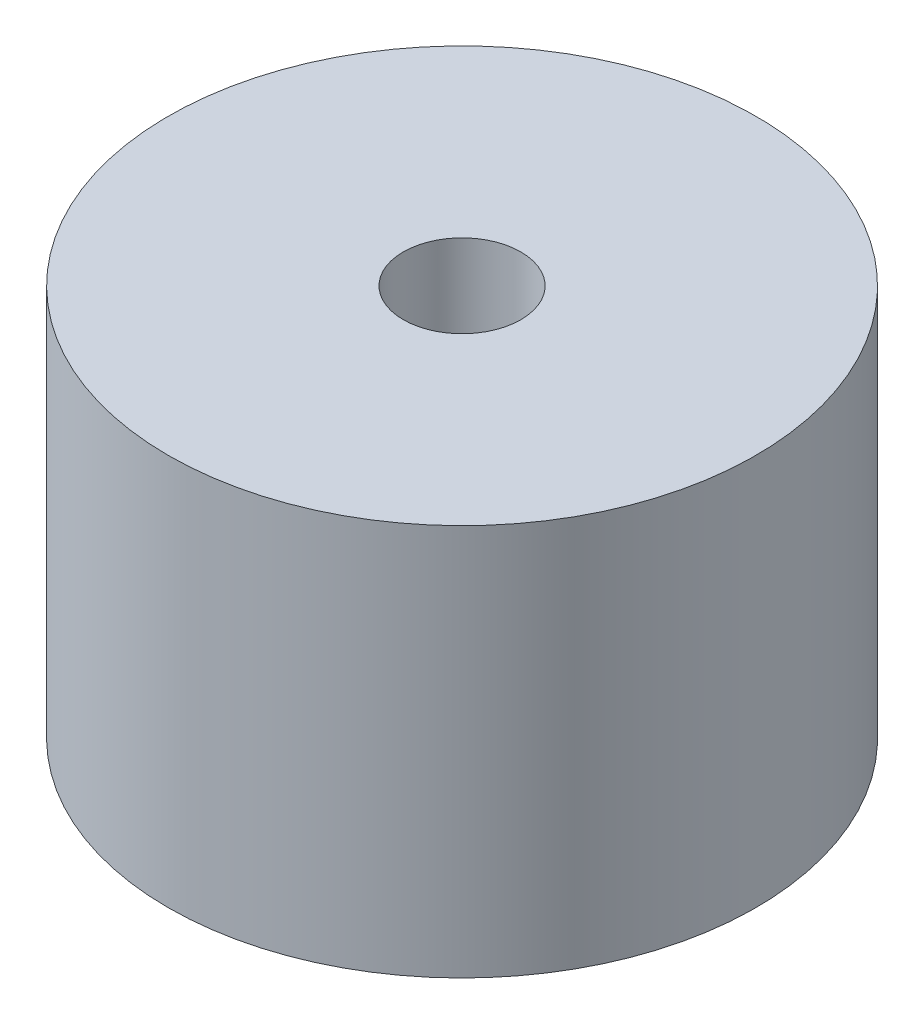
ISO-10303-21;
HEADER;
FILE_DESCRIPTION(('STEP AP214'),'2;1');
FILE_NAME('part.step','',(''),(''),'','','');
FILE_SCHEMA(('AUTOMOTIVE_DESIGN { 1 0 10303 214 1 1 1 1 }'));
ENDSEC;
DATA;
#1=APPLICATION_CONTEXT('core data for automotive mechanical design processes');
#2=APPLICATION_PROTOCOL_DEFINITION('international standard','automotive_design',2000,#1);
#3=PRODUCT_CONTEXT('',#1,'mechanical');
#4=PRODUCT('Part','Part','',(#3));
#5=PRODUCT_RELATED_PRODUCT_CATEGORY('part','',(#4));
#6=PRODUCT_DEFINITION_FORMATION('','',#4);
#7=PRODUCT_DEFINITION_CONTEXT('part definition',#1,'design');
#8=PRODUCT_DEFINITION('design','',#6,#7);
#9=PRODUCT_DEFINITION_SHAPE('','',#8);
#10=(LENGTH_UNIT() NAMED_UNIT(*) SI_UNIT(.MILLI.,.METRE.));
#11=(NAMED_UNIT(*) PLANE_ANGLE_UNIT() SI_UNIT($,.RADIAN.));
#12=(NAMED_UNIT(*) SI_UNIT($,.STERADIAN.) SOLID_ANGLE_UNIT());
#13=UNCERTAINTY_MEASURE_WITH_UNIT(LENGTH_MEASURE(1.E-05),#10,'distance_accuracy_value','');
#14=(GEOMETRIC_REPRESENTATION_CONTEXT(3) GLOBAL_UNCERTAINTY_ASSIGNED_CONTEXT((#13)) GLOBAL_UNIT_ASSIGNED_CONTEXT((#10,
#11,#12)) REPRESENTATION_CONTEXT('',''));
#15=CARTESIAN_POINT('',(0.,0.,0.));
#16=DIRECTION('',(0.,0.,1.));
#17=DIRECTION('',(1.,0.,0.));
#18=AXIS2_PLACEMENT_3D('',#15,#16,#17);
#19=CARTESIAN_POINT('',(0.,20.,0.));
#20=DIRECTION('',(0.,-1.,0.));
#21=DIRECTION('',(0.,0.,-1.));
#22=AXIS2_PLACEMENT_3D('',#19,#20,#21);
#23=CYLINDRICAL_SURFACE('',#22,15.);
#24=CARTESIAN_POINT('',(0.,20.,0.));
#25=DIRECTION('',(0.,1.,0.));
#26=DIRECTION('',(0.,0.,1.));
#27=AXIS2_PLACEMENT_3D('',#24,#25,#26);
#28=CIRCLE('',#27,15.);
#29=CARTESIAN_POINT('',(0.,20.,15.));
#30=VERTEX_POINT('',#29);
#31=EDGE_CURVE('E10',#30,#30,#28,.T.);
#32=ORIENTED_EDGE('',*,*,#31,.F.);
#33=EDGE_LOOP('',(#32));
#34=FACE_BOUND('',#33,.T.);
#35=CARTESIAN_POINT('',(0.,0.,0.));
#36=DIRECTION('',(0.,1.,0.));
#37=DIRECTION('',(0.,0.,1.));
#38=AXIS2_PLACEMENT_3D('',#35,#36,#37);
#39=CIRCLE('',#38,15.);
#40=CARTESIAN_POINT('',(0.,0.,15.));
#41=VERTEX_POINT('',#40);
#42=EDGE_CURVE('E33',#41,#41,#39,.T.);
#43=ORIENTED_EDGE('',*,*,#42,.T.);
#44=EDGE_LOOP('',(#43));
#45=FACE_BOUND('',#44,.T.);
#46=ADVANCED_FACE('F30',(#34,#45),#23,.T.);
#47=CARTESIAN_POINT('',(0.,20.,0.));
#48=DIRECTION('',(0.,1.,0.));
#49=DIRECTION('',(0.,0.,1.));
#50=AXIS2_PLACEMENT_3D('',#47,#48,#49);
#51=PLANE('',#50);
#52=CARTESIAN_POINT('',(0.,20.,0.));
#53=DIRECTION('',(0.,1.,0.));
#54=DIRECTION('',(0.,0.,1.));
#55=AXIS2_PLACEMENT_3D('',#52,#53,#54);
#56=CIRCLE('',#55,3.);
#57=CARTESIAN_POINT('',(0.,20.,3.));
#58=VERTEX_POINT('',#57);
#59=EDGE_CURVE('E45',#58,#58,#56,.T.);
#60=ORIENTED_EDGE('',*,*,#59,.F.);
#61=EDGE_LOOP('',(#60));
#62=FACE_BOUND('',#61,.T.);
#63=ORIENTED_EDGE('',*,*,#31,.T.);
#64=EDGE_LOOP('',(#63));
#65=FACE_BOUND('',#64,.T.);
#66=ADVANCED_FACE('F91',(#62,#65),#51,.T.);
#67=CARTESIAN_POINT('',(0.,0.,0.));
#68=DIRECTION('',(0.,1.,0.));
#69=DIRECTION('',(0.,0.,1.));
#70=AXIS2_PLACEMENT_3D('',#67,#68,#69);
#71=PLANE('',#70);
#72=CARTESIAN_POINT('',(0.,0.,-12.7));
#73=DIRECTION('',(0.,-1.,0.));
#74=DIRECTION('',(0.,0.,-1.));
#75=AXIS2_PLACEMENT_3D('',#72,#73,#74);
#76=CIRCLE('',#75,1.5);
#77=CARTESIAN_POINT('',(0.,0.,-14.2));
#78=VERTEX_POINT('',#77);
#79=EDGE_CURVE('E72',#78,#78,#76,.T.);
#80=ORIENTED_EDGE('',*,*,#79,.F.);
#81=EDGE_LOOP('',(#80));
#82=FACE_BOUND('',#81,.T.);
#83=CARTESIAN_POINT('',(-12.7,0.,0.));
#84=DIRECTION('',(0.,-1.,0.));
#85=DIRECTION('',(0.,0.,-1.));
#86=AXIS2_PLACEMENT_3D('',#83,#84,#85);
#87=CIRCLE('',#86,1.5);
#88=CARTESIAN_POINT('',(-12.7,0.,-1.5));
#89=VERTEX_POINT('',#88);
#90=EDGE_CURVE('E66',#89,#89,#87,.T.);
#91=ORIENTED_EDGE('',*,*,#90,.F.);
#92=EDGE_LOOP('',(#91));
#93=FACE_BOUND('',#92,.T.);
#94=CARTESIAN_POINT('',(0.,0.,12.7));
#95=DIRECTION('',(0.,-1.,0.));
#96=DIRECTION('',(0.,0.,-1.));
#97=AXIS2_PLACEMENT_3D('',#94,#95,#96);
#98=CIRCLE('',#97,1.5);
#99=CARTESIAN_POINT('',(0.,0.,11.2));
#100=VERTEX_POINT('',#99);
#101=EDGE_CURVE('E60',#100,#100,#98,.T.);
#102=ORIENTED_EDGE('',*,*,#101,.F.);
#103=EDGE_LOOP('',(#102));
#104=FACE_BOUND('',#103,.T.);
#105=CARTESIAN_POINT('',(12.7,0.,0.));
#106=DIRECTION('',(0.,-1.,0.));
#107=DIRECTION('',(0.,0.,-1.));
#108=AXIS2_PLACEMENT_3D('',#105,#106,#107);
#109=CIRCLE('',#108,1.5);
#110=CARTESIAN_POINT('',(12.7,0.,-1.5));
#111=VERTEX_POINT('',#110);
#112=EDGE_CURVE('E54',#111,#111,#109,.T.);
#113=ORIENTED_EDGE('',*,*,#112,.F.);
#114=EDGE_LOOP('',(#113));
#115=FACE_BOUND('',#114,.T.);
#116=CARTESIAN_POINT('',(0.,0.,0.));
#117=DIRECTION('',(0.,-1.,0.));
#118=DIRECTION('',(0.,0.,-1.));
#119=AXIS2_PLACEMENT_3D('',#116,#117,#118);
#120=CIRCLE('',#119,10.);
#121=CARTESIAN_POINT('',(0.,0.,-10.));
#122=VERTEX_POINT('',#121);
#123=EDGE_CURVE('E42',#122,#122,#120,.T.);
#124=ORIENTED_EDGE('',*,*,#123,.F.);
#125=EDGE_LOOP('',(#124));
#126=FACE_BOUND('',#125,.T.);
#127=ORIENTED_EDGE('',*,*,#42,.F.);
#128=EDGE_LOOP('',(#127));
#129=FACE_BOUND('',#128,.T.);
#130=ADVANCED_FACE('F87',(#82,#93,#104,#115,#126,#129),#71,.F.);
#131=CARTESIAN_POINT('',(0.,12.,0.));
#132=DIRECTION('',(0.,-1.,0.));
#133=DIRECTION('',(0.,0.,-1.));
#134=AXIS2_PLACEMENT_3D('',#131,#132,#133);
#135=CYLINDRICAL_SURFACE('',#134,10.);
#136=CARTESIAN_POINT('',(0.,12.,0.));
#137=DIRECTION('',(0.,-1.,0.));
#138=DIRECTION('',(0.,0.,-1.));
#139=AXIS2_PLACEMENT_3D('',#136,#137,#138);
#140=CIRCLE('',#139,10.);
#141=CARTESIAN_POINT('',(0.,12.,-10.));
#142=VERTEX_POINT('',#141);
#143=EDGE_CURVE('E40',#142,#142,#140,.T.);
#144=ORIENTED_EDGE('',*,*,#143,.F.);
#145=EDGE_LOOP('',(#144));
#146=FACE_BOUND('',#145,.T.);
#147=ORIENTED_EDGE('',*,*,#123,.T.);
#148=EDGE_LOOP('',(#147));
#149=FACE_BOUND('',#148,.T.);
#150=ADVANCED_FACE('F90',(#146,#149),#135,.F.);
#151=CARTESIAN_POINT('',(0.,12.,0.));
#152=DIRECTION('',(0.,-1.,0.));
#153=DIRECTION('',(0.,0.,-1.));
#154=AXIS2_PLACEMENT_3D('',#151,#152,#153);
#155=PLANE('',#154);
#156=CARTESIAN_POINT('',(0.,12.,0.));
#157=DIRECTION('',(0.,-1.,0.));
#158=DIRECTION('',(0.,0.,-1.));
#159=AXIS2_PLACEMENT_3D('',#156,#157,#158);
#160=CIRCLE('',#159,3.);
#161=CARTESIAN_POINT('',(0.,12.,-3.));
#162=VERTEX_POINT('',#161);
#163=EDGE_CURVE('E50',#162,#162,#160,.T.);
#164=ORIENTED_EDGE('',*,*,#163,.F.);
#165=EDGE_LOOP('',(#164));
#166=FACE_BOUND('',#165,.T.);
#167=ORIENTED_EDGE('',*,*,#143,.T.);
#168=EDGE_LOOP('',(#167));
#169=FACE_BOUND('',#168,.T.);
#170=ADVANCED_FACE('F115',(#166,#169),#155,.T.);
#171=CARTESIAN_POINT('',(0.,24.,0.));
#172=DIRECTION('',(0.,-1.,0.));
#173=DIRECTION('',(0.,0.,-1.));
#174=AXIS2_PLACEMENT_3D('',#171,#172,#173);
#175=CYLINDRICAL_SURFACE('',#174,3.);
#176=ORIENTED_EDGE('',*,*,#59,.T.);
#177=EDGE_LOOP('',(#176));
#178=FACE_BOUND('',#177,.T.);
#179=ORIENTED_EDGE('',*,*,#163,.T.);
#180=EDGE_LOOP('',(#179));
#181=FACE_BOUND('',#180,.T.);
#182=ADVANCED_FACE('F119',(#178,#181),#175,.F.);
#183=CARTESIAN_POINT('',(12.7,8.,0.));
#184=DIRECTION('',(0.,-1.,0.));
#185=DIRECTION('',(0.,0.,-1.));
#186=AXIS2_PLACEMENT_3D('',#183,#184,#185);
#187=CYLINDRICAL_SURFACE('',#186,1.5);
#188=CARTESIAN_POINT('',(12.7,8.,0.));
#189=DIRECTION('',(0.,-1.,0.));
#190=DIRECTION('',(0.,0.,-1.));
#191=AXIS2_PLACEMENT_3D('',#188,#189,#190);
#192=CIRCLE('',#191,1.5);
#193=CARTESIAN_POINT('',(12.7,8.,-1.5));
#194=VERTEX_POINT('',#193);
#195=EDGE_CURVE('E53',#194,#194,#192,.T.);
#196=ORIENTED_EDGE('',*,*,#195,.F.);
#197=EDGE_LOOP('',(#196));
#198=FACE_BOUND('',#197,.T.);
#199=ORIENTED_EDGE('',*,*,#112,.T.);
#200=EDGE_LOOP('',(#199));
#201=FACE_BOUND('',#200,.T.);
#202=ADVANCED_FACE('F123',(#198,#201),#187,.F.);
#203=CARTESIAN_POINT('',(12.7,8.,0.));
#204=DIRECTION('',(0.,-1.,0.));
#205=DIRECTION('',(0.,0.,-1.));
#206=AXIS2_PLACEMENT_3D('',#203,#204,#205);
#207=PLANE('',#206);
#208=ORIENTED_EDGE('',*,*,#195,.T.);
#209=EDGE_LOOP('',(#208));
#210=FACE_BOUND('',#209,.T.);
#211=ADVANCED_FACE('F127',(#210),#207,.T.);
#212=CARTESIAN_POINT('',(0.,8.,12.7));
#213=DIRECTION('',(0.,-1.,0.));
#214=DIRECTION('',(0.,0.,-1.));
#215=AXIS2_PLACEMENT_3D('',#212,#213,#214);
#216=CYLINDRICAL_SURFACE('',#215,1.5);
#217=CARTESIAN_POINT('',(0.,8.,12.7));
#218=DIRECTION('',(0.,-1.,0.));
#219=DIRECTION('',(0.,0.,-1.));
#220=AXIS2_PLACEMENT_3D('',#217,#218,#219);
#221=CIRCLE('',#220,1.5);
#222=CARTESIAN_POINT('',(0.,8.,11.2));
#223=VERTEX_POINT('',#222);
#224=EDGE_CURVE('E57',#223,#223,#221,.T.);
#225=ORIENTED_EDGE('',*,*,#224,.F.);
#226=EDGE_LOOP('',(#225));
#227=FACE_BOUND('',#226,.T.);
#228=ORIENTED_EDGE('',*,*,#101,.T.);
#229=EDGE_LOOP('',(#228));
#230=FACE_BOUND('',#229,.T.);
#231=ADVANCED_FACE('F131',(#227,#230),#216,.F.);
#232=CARTESIAN_POINT('',(0.,8.,12.7));
#233=DIRECTION('',(0.,-1.,0.));
#234=DIRECTION('',(0.,0.,-1.));
#235=AXIS2_PLACEMENT_3D('',#232,#233,#234);
#236=PLANE('',#235);
#237=ORIENTED_EDGE('',*,*,#224,.T.);
#238=EDGE_LOOP('',(#237));
#239=FACE_BOUND('',#238,.T.);
#240=ADVANCED_FACE('F135',(#239),#236,.T.);
#241=CARTESIAN_POINT('',(-12.7,8.,0.));
#242=DIRECTION('',(0.,-1.,0.));
#243=DIRECTION('',(0.,0.,-1.));
#244=AXIS2_PLACEMENT_3D('',#241,#242,#243);
#245=CYLINDRICAL_SURFACE('',#244,1.5);
#246=CARTESIAN_POINT('',(-12.7,8.,0.));
#247=DIRECTION('',(0.,-1.,0.));
#248=DIRECTION('',(0.,0.,-1.));
#249=AXIS2_PLACEMENT_3D('',#246,#247,#248);
#250=CIRCLE('',#249,1.5);
#251=CARTESIAN_POINT('',(-12.7,8.,-1.5));
#252=VERTEX_POINT('',#251);
#253=EDGE_CURVE('E63',#252,#252,#250,.T.);
#254=ORIENTED_EDGE('',*,*,#253,.F.);
#255=EDGE_LOOP('',(#254));
#256=FACE_BOUND('',#255,.T.);
#257=ORIENTED_EDGE('',*,*,#90,.T.);
#258=EDGE_LOOP('',(#257));
#259=FACE_BOUND('',#258,.T.);
#260=ADVANCED_FACE('F139',(#256,#259),#245,.F.);
#261=CARTESIAN_POINT('',(-12.7,8.,0.));
#262=DIRECTION('',(0.,-1.,0.));
#263=DIRECTION('',(0.,0.,-1.));
#264=AXIS2_PLACEMENT_3D('',#261,#262,#263);
#265=PLANE('',#264);
#266=ORIENTED_EDGE('',*,*,#253,.T.);
#267=EDGE_LOOP('',(#266));
#268=FACE_BOUND('',#267,.T.);
#269=ADVANCED_FACE('F83',(#268),#265,.T.);
#270=CARTESIAN_POINT('',(0.,8.,-12.7));
#271=DIRECTION('',(0.,-1.,0.));
#272=DIRECTION('',(0.,0.,-1.));
#273=AXIS2_PLACEMENT_3D('',#270,#271,#272);
#274=CYLINDRICAL_SURFACE('',#273,1.5);
#275=CARTESIAN_POINT('',(0.,8.,-12.7));
#276=DIRECTION('',(0.,-1.,0.));
#277=DIRECTION('',(0.,0.,-1.));
#278=AXIS2_PLACEMENT_3D('',#275,#276,#277);
#279=CIRCLE('',#278,1.5);
#280=CARTESIAN_POINT('',(0.,8.,-14.2));
#281=VERTEX_POINT('',#280);
#282=EDGE_CURVE('E69',#281,#281,#279,.T.);
#283=ORIENTED_EDGE('',*,*,#282,.F.);
#284=EDGE_LOOP('',(#283));
#285=FACE_BOUND('',#284,.T.);
#286=ORIENTED_EDGE('',*,*,#79,.T.);
#287=EDGE_LOOP('',(#286));
#288=FACE_BOUND('',#287,.T.);
#289=ADVANCED_FACE('F80',(#285,#288),#274,.F.);
#290=CARTESIAN_POINT('',(0.,8.,-12.7));
#291=DIRECTION('',(0.,-1.,0.));
#292=DIRECTION('',(0.,0.,-1.));
#293=AXIS2_PLACEMENT_3D('',#290,#291,#292);
#294=PLANE('',#293);
#295=ORIENTED_EDGE('',*,*,#282,.T.);
#296=EDGE_LOOP('',(#295));
#297=FACE_BOUND('',#296,.T.);
#298=ADVANCED_FACE('F78',(#297),#294,.T.);
#299=CLOSED_SHELL('',(#46,#66,#130,#150,#170,#182,#202,#211,#231,#240,#260,#269,#289,#298));
#300=MANIFOLD_SOLID_BREP('B2',#299);
#301=ADVANCED_BREP_SHAPE_REPRESENTATION('',(#18,#300),#14);
#302=SHAPE_DEFINITION_REPRESENTATION(#9,#301);
ENDSEC;
END-ISO-10303-21;
